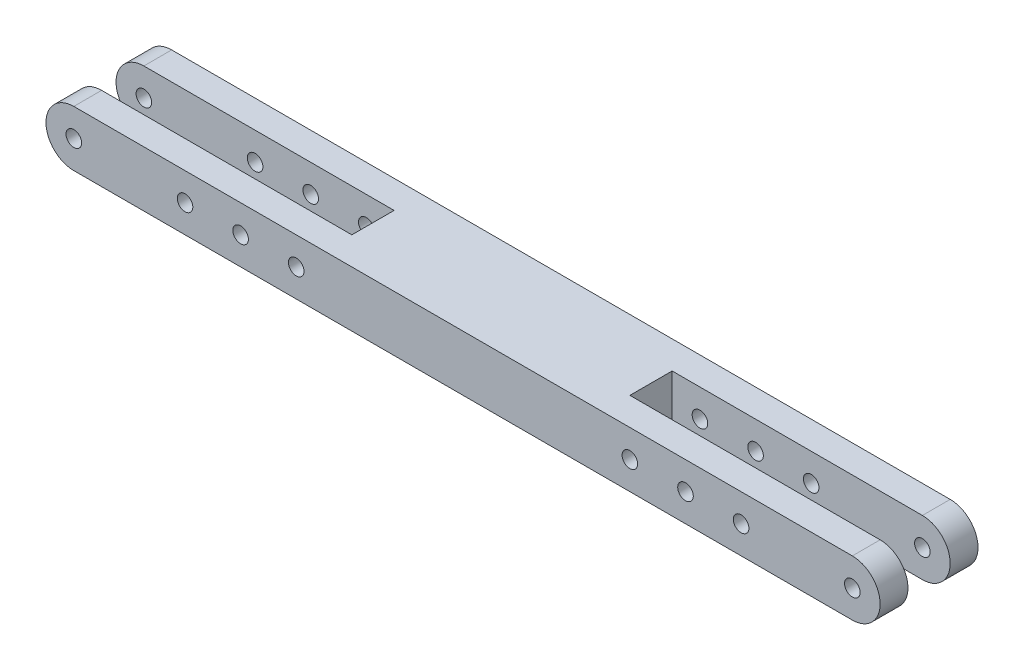
ISO-10303-21;
HEADER;
FILE_DESCRIPTION(('STEP AP214'),'2;1');
FILE_NAME('part.step','',(''),(''),'','','');
FILE_SCHEMA(('AUTOMOTIVE_DESIGN { 1 0 10303 214 1 1 1 1 }'));
ENDSEC;
DATA;
#1=APPLICATION_CONTEXT('core data for automotive mechanical design processes');
#2=APPLICATION_PROTOCOL_DEFINITION('international standard','automotive_design',2000,#1);
#3=PRODUCT_CONTEXT('',#1,'mechanical');
#4=PRODUCT('Part','Part','',(#3));
#5=PRODUCT_RELATED_PRODUCT_CATEGORY('part','',(#4));
#6=PRODUCT_DEFINITION_FORMATION('','',#4);
#7=PRODUCT_DEFINITION_CONTEXT('part definition',#1,'design');
#8=PRODUCT_DEFINITION('design','',#6,#7);
#9=PRODUCT_DEFINITION_SHAPE('','',#8);
#10=(LENGTH_UNIT() NAMED_UNIT(*) SI_UNIT(.MILLI.,.METRE.));
#11=(NAMED_UNIT(*) PLANE_ANGLE_UNIT() SI_UNIT($,.RADIAN.));
#12=(NAMED_UNIT(*) SI_UNIT($,.STERADIAN.) SOLID_ANGLE_UNIT());
#13=UNCERTAINTY_MEASURE_WITH_UNIT(LENGTH_MEASURE(1.E-05),#10,'distance_accuracy_value','');
#14=(GEOMETRIC_REPRESENTATION_CONTEXT(3) GLOBAL_UNCERTAINTY_ASSIGNED_CONTEXT((#13)) GLOBAL_UNIT_ASSIGNED_CONTEXT((#10,
#11,#12)) REPRESENTATION_CONTEXT('',''));
#15=CARTESIAN_POINT('',(0.,0.,0.));
#16=DIRECTION('',(0.,0.,1.));
#17=DIRECTION('',(1.,0.,0.));
#18=AXIS2_PLACEMENT_3D('',#15,#16,#17);
#19=CARTESIAN_POINT('',(177.8,0.,22.352));
#20=DIRECTION('',(0.,0.,-1.));
#21=DIRECTION('',(-1.,0.,0.));
#22=AXIS2_PLACEMENT_3D('',#19,#20,#21);
#23=CYLINDRICAL_SURFACE('',#22,6.35);
#24=CARTESIAN_POINT('',(177.8,0.,16.002));
#25=DIRECTION('',(0.,0.,1.));
#26=DIRECTION('',(1.,0.,0.));
#27=AXIS2_PLACEMENT_3D('',#24,#25,#26);
#28=CIRCLE('',#27,6.35);
#29=CARTESIAN_POINT('',(177.8,-6.35,16.002));
#30=VERTEX_POINT('',#29);
#31=CARTESIAN_POINT('',(177.8,6.35,16.002));
#32=VERTEX_POINT('',#31);
#33=EDGE_CURVE('E174',#30,#32,#28,.T.);
#34=ORIENTED_EDGE('',*,*,#33,.T.);
#35=DIRECTION('',(0.,0.,-1.));
#36=VECTOR('',#35,1.);
#37=CARTESIAN_POINT('',(177.8,6.35,22.352));
#38=LINE('',#37,#36);
#39=CARTESIAN_POINT('',(177.8,6.35,22.352));
#40=VERTEX_POINT('',#39);
#41=EDGE_CURVE('E295',#40,#32,#38,.T.);
#42=ORIENTED_EDGE('',*,*,#41,.F.);
#43=CARTESIAN_POINT('',(177.8,0.,22.352));
#44=DIRECTION('',(0.,0.,1.));
#45=DIRECTION('',(-1.,0.,0.));
#46=AXIS2_PLACEMENT_3D('',#43,#44,#45);
#47=CIRCLE('',#46,6.35);
#48=CARTESIAN_POINT('',(177.8,-6.35,22.352));
#49=VERTEX_POINT('',#48);
#50=EDGE_CURVE('E276',#49,#40,#47,.T.);
#51=ORIENTED_EDGE('',*,*,#50,.F.);
#52=DIRECTION('',(0.,0.,-1.));
#53=VECTOR('',#52,1.);
#54=CARTESIAN_POINT('',(177.8,-6.35,22.352));
#55=LINE('',#54,#53);
#56=EDGE_CURVE('E298',#49,#30,#55,.T.);
#57=ORIENTED_EDGE('',*,*,#56,.T.);
#58=EDGE_LOOP('',(#34,#42,#51,#57));
#59=FACE_BOUND('',#58,.T.);
#60=ADVANCED_FACE('F33',(#59),#23,.T.);
#61=CARTESIAN_POINT('',(127.,0.,22.352));
#62=DIRECTION('',(0.,0.,-1.));
#63=DIRECTION('',(-1.,0.,0.));
#64=AXIS2_PLACEMENT_3D('',#61,#62,#63);
#65=CYLINDRICAL_SURFACE('',#64,1.77800000000003);
#66=CARTESIAN_POINT('',(127.,0.,16.002));
#67=DIRECTION('',(0.,0.,1.));
#68=DIRECTION('',(1.,0.,0.));
#69=AXIS2_PLACEMENT_3D('',#66,#67,#68);
#70=CIRCLE('',#69,1.77800000000003);
#71=CARTESIAN_POINT('',(128.778,0.,16.002));
#72=VERTEX_POINT('',#71);
#73=EDGE_CURVE('E171',#72,#72,#70,.T.);
#74=ORIENTED_EDGE('',*,*,#73,.F.);
#75=EDGE_LOOP('',(#74));
#76=FACE_BOUND('',#75,.T.);
#77=CARTESIAN_POINT('',(127.,0.,22.352));
#78=DIRECTION('',(0.,0.,1.));
#79=DIRECTION('',(-1.,0.,0.));
#80=AXIS2_PLACEMENT_3D('',#77,#78,#79);
#81=CIRCLE('',#80,1.77800000000003);
#82=CARTESIAN_POINT('',(125.222,0.,22.352));
#83=VERTEX_POINT('',#82);
#84=EDGE_CURVE('E240',#83,#83,#81,.T.);
#85=ORIENTED_EDGE('',*,*,#84,.T.);
#86=EDGE_LOOP('',(#85));
#87=FACE_BOUND('',#86,.T.);
#88=ADVANCED_FACE('F336',(#76,#87),#65,.F.);
#89=CARTESIAN_POINT('',(139.7,0.,22.352));
#90=DIRECTION('',(0.,0.,-1.));
#91=DIRECTION('',(-1.,0.,0.));
#92=AXIS2_PLACEMENT_3D('',#89,#90,#91);
#93=CYLINDRICAL_SURFACE('',#92,1.77800000000001);
#94=CARTESIAN_POINT('',(139.7,0.,16.002));
#95=DIRECTION('',(0.,0.,1.));
#96=DIRECTION('',(1.,0.,0.));
#97=AXIS2_PLACEMENT_3D('',#94,#95,#96);
#98=CIRCLE('',#97,1.77800000000001);
#99=CARTESIAN_POINT('',(141.478,0.,16.002));
#100=VERTEX_POINT('',#99);
#101=EDGE_CURVE('E168',#100,#100,#98,.T.);
#102=ORIENTED_EDGE('',*,*,#101,.F.);
#103=EDGE_LOOP('',(#102));
#104=FACE_BOUND('',#103,.T.);
#105=CARTESIAN_POINT('',(139.7,0.,22.352));
#106=DIRECTION('',(0.,0.,1.));
#107=DIRECTION('',(-1.,0.,0.));
#108=AXIS2_PLACEMENT_3D('',#105,#106,#107);
#109=CIRCLE('',#108,1.77800000000001);
#110=CARTESIAN_POINT('',(137.922,0.,22.352));
#111=VERTEX_POINT('',#110);
#112=EDGE_CURVE('E234',#111,#111,#109,.T.);
#113=ORIENTED_EDGE('',*,*,#112,.T.);
#114=EDGE_LOOP('',(#113));
#115=FACE_BOUND('',#114,.T.);
#116=ADVANCED_FACE('F343',(#104,#115),#93,.F.);
#117=CARTESIAN_POINT('',(152.4,0.,22.352));
#118=DIRECTION('',(0.,0.,-1.));
#119=DIRECTION('',(-1.,0.,0.));
#120=AXIS2_PLACEMENT_3D('',#117,#118,#119);
#121=CYLINDRICAL_SURFACE('',#120,1.77800000000001);
#122=CARTESIAN_POINT('',(152.4,0.,16.002));
#123=DIRECTION('',(0.,0.,1.));
#124=DIRECTION('',(1.,0.,0.));
#125=AXIS2_PLACEMENT_3D('',#122,#123,#124);
#126=CIRCLE('',#125,1.77800000000001);
#127=CARTESIAN_POINT('',(154.178,0.,16.002));
#128=VERTEX_POINT('',#127);
#129=EDGE_CURVE('E165',#128,#128,#126,.T.);
#130=ORIENTED_EDGE('',*,*,#129,.F.);
#131=EDGE_LOOP('',(#130));
#132=FACE_BOUND('',#131,.T.);
#133=CARTESIAN_POINT('',(152.4,0.,22.352));
#134=DIRECTION('',(0.,0.,1.));
#135=DIRECTION('',(-1.,0.,0.));
#136=AXIS2_PLACEMENT_3D('',#133,#134,#135);
#137=CIRCLE('',#136,1.77800000000001);
#138=CARTESIAN_POINT('',(150.622,0.,22.352));
#139=VERTEX_POINT('',#138);
#140=EDGE_CURVE('E228',#139,#139,#137,.T.);
#141=ORIENTED_EDGE('',*,*,#140,.T.);
#142=EDGE_LOOP('',(#141));
#143=FACE_BOUND('',#142,.T.);
#144=ADVANCED_FACE('F406',(#132,#143),#121,.F.);
#145=CARTESIAN_POINT('',(177.8,0.,22.352));
#146=DIRECTION('',(0.,0.,-1.));
#147=DIRECTION('',(-1.,0.,0.));
#148=AXIS2_PLACEMENT_3D('',#145,#146,#147);
#149=CYLINDRICAL_SURFACE('',#148,1.77800000000001);
#150=CARTESIAN_POINT('',(177.8,0.,16.002));
#151=DIRECTION('',(0.,0.,1.));
#152=DIRECTION('',(1.,0.,0.));
#153=AXIS2_PLACEMENT_3D('',#150,#151,#152);
#154=CIRCLE('',#153,1.77800000000001);
#155=CARTESIAN_POINT('',(179.578,0.,16.002));
#156=VERTEX_POINT('',#155);
#157=EDGE_CURVE('E37',#156,#156,#154,.T.);
#158=ORIENTED_EDGE('',*,*,#157,.F.);
#159=EDGE_LOOP('',(#158));
#160=FACE_BOUND('',#159,.T.);
#161=CARTESIAN_POINT('',(177.8,0.,22.352));
#162=DIRECTION('',(0.,0.,1.));
#163=DIRECTION('',(-1.,0.,0.));
#164=AXIS2_PLACEMENT_3D('',#161,#162,#163);
#165=CIRCLE('',#164,1.77800000000001);
#166=CARTESIAN_POINT('',(176.022,0.,22.352));
#167=VERTEX_POINT('',#166);
#168=EDGE_CURVE('E222',#167,#167,#165,.T.);
#169=ORIENTED_EDGE('',*,*,#168,.T.);
#170=EDGE_LOOP('',(#169));
#171=FACE_BOUND('',#170,.T.);
#172=ADVANCED_FACE('F314',(#160,#171),#149,.F.);
#173=CARTESIAN_POINT('',(0.,0.,22.352));
#174=DIRECTION('',(0.,0.,-1.));
#175=DIRECTION('',(-1.,0.,0.));
#176=AXIS2_PLACEMENT_3D('',#173,#174,#175);
#177=CYLINDRICAL_SURFACE('',#176,6.35);
#178=CARTESIAN_POINT('',(0.,0.,6.35));
#179=DIRECTION('',(0.,0.,-1.));
#180=DIRECTION('',(-1.,0.,0.));
#181=AXIS2_PLACEMENT_3D('',#178,#179,#180);
#182=CIRCLE('',#181,6.35);
#183=CARTESIAN_POINT('',(0.,-6.35,6.35));
#184=VERTEX_POINT('',#183);
#185=CARTESIAN_POINT('',(0.,6.35,6.35));
#186=VERTEX_POINT('',#185);
#187=EDGE_CURVE('E219',#184,#186,#182,.T.);
#188=ORIENTED_EDGE('',*,*,#187,.T.);
#189=DIRECTION('',(0.,0.,-1.));
#190=VECTOR('',#189,1.);
#191=CARTESIAN_POINT('',(0.,6.35,22.352));
#192=LINE('',#191,#190);
#193=CARTESIAN_POINT('',(0.,6.35,0.));
#194=VERTEX_POINT('',#193);
#195=EDGE_CURVE('E280',#186,#194,#192,.T.);
#196=ORIENTED_EDGE('',*,*,#195,.T.);
#197=CARTESIAN_POINT('',(0.,0.,0.));
#198=DIRECTION('',(0.,0.,1.));
#199=DIRECTION('',(1.,0.,0.));
#200=AXIS2_PLACEMENT_3D('',#197,#198,#199);
#201=CIRCLE('',#200,6.35);
#202=CARTESIAN_POINT('',(0.,-6.35,0.));
#203=VERTEX_POINT('',#202);
#204=EDGE_CURVE('E267',#194,#203,#201,.T.);
#205=ORIENTED_EDGE('',*,*,#204,.T.);
#206=DIRECTION('',(0.,0.,-1.));
#207=VECTOR('',#206,1.);
#208=CARTESIAN_POINT('',(0.,-6.35,22.352));
#209=LINE('',#208,#207);
#210=EDGE_CURVE('E42',#184,#203,#209,.T.);
#211=ORIENTED_EDGE('',*,*,#210,.F.);
#212=EDGE_LOOP('',(#188,#196,#205,#211));
#213=FACE_BOUND('',#212,.T.);
#214=ADVANCED_FACE('F328',(#213),#177,.T.);
#215=CARTESIAN_POINT('',(0.,0.,22.352));
#216=DIRECTION('',(0.,0.,-1.));
#217=DIRECTION('',(-1.,0.,0.));
#218=AXIS2_PLACEMENT_3D('',#215,#216,#217);
#219=CYLINDRICAL_SURFACE('',#218,1.778);
#220=CARTESIAN_POINT('',(0.,0.,6.35));
#221=DIRECTION('',(0.,0.,-1.));
#222=DIRECTION('',(-1.,0.,0.));
#223=AXIS2_PLACEMENT_3D('',#220,#221,#222);
#224=CIRCLE('',#223,1.778);
#225=CARTESIAN_POINT('',(-1.778,0.,6.35));
#226=VERTEX_POINT('',#225);
#227=EDGE_CURVE('E216',#226,#226,#224,.T.);
#228=ORIENTED_EDGE('',*,*,#227,.F.);
#229=EDGE_LOOP('',(#228));
#230=FACE_BOUND('',#229,.T.);
#231=CARTESIAN_POINT('',(0.,0.,0.));
#232=DIRECTION('',(0.,0.,1.));
#233=DIRECTION('',(1.,0.,0.));
#234=AXIS2_PLACEMENT_3D('',#231,#232,#233);
#235=CIRCLE('',#234,1.778);
#236=CARTESIAN_POINT('',(1.778,0.,0.));
#237=VERTEX_POINT('',#236);
#238=EDGE_CURVE('E261',#237,#237,#235,.T.);
#239=ORIENTED_EDGE('',*,*,#238,.F.);
#240=EDGE_LOOP('',(#239));
#241=FACE_BOUND('',#240,.T.);
#242=ADVANCED_FACE('F428',(#230,#241),#219,.F.);
#243=CARTESIAN_POINT('',(25.4,0.,22.352));
#244=DIRECTION('',(0.,0.,-1.));
#245=DIRECTION('',(-1.,0.,0.));
#246=AXIS2_PLACEMENT_3D('',#243,#244,#245);
#247=CYLINDRICAL_SURFACE('',#246,1.778);
#248=CARTESIAN_POINT('',(25.4,0.,6.35));
#249=DIRECTION('',(0.,0.,-1.));
#250=DIRECTION('',(-1.,0.,0.));
#251=AXIS2_PLACEMENT_3D('',#248,#249,#250);
#252=CIRCLE('',#251,1.778);
#253=CARTESIAN_POINT('',(23.622,0.,6.35));
#254=VERTEX_POINT('',#253);
#255=EDGE_CURVE('E213',#254,#254,#252,.T.);
#256=ORIENTED_EDGE('',*,*,#255,.F.);
#257=EDGE_LOOP('',(#256));
#258=FACE_BOUND('',#257,.T.);
#259=CARTESIAN_POINT('',(25.4,0.,0.));
#260=DIRECTION('',(0.,0.,1.));
#261=DIRECTION('',(1.,0.,0.));
#262=AXIS2_PLACEMENT_3D('',#259,#260,#261);
#263=CIRCLE('',#262,1.778);
#264=CARTESIAN_POINT('',(27.178,0.,0.));
#265=VERTEX_POINT('',#264);
#266=EDGE_CURVE('E255',#265,#265,#263,.T.);
#267=ORIENTED_EDGE('',*,*,#266,.F.);
#268=EDGE_LOOP('',(#267));
#269=FACE_BOUND('',#268,.T.);
#270=ADVANCED_FACE('F425',(#258,#269),#247,.F.);
#271=CARTESIAN_POINT('',(38.1,0.,22.352));
#272=DIRECTION('',(0.,0.,-1.));
#273=DIRECTION('',(-1.,0.,0.));
#274=AXIS2_PLACEMENT_3D('',#271,#272,#273);
#275=CYLINDRICAL_SURFACE('',#274,1.778);
#276=CARTESIAN_POINT('',(38.1,0.,6.35));
#277=DIRECTION('',(0.,0.,-1.));
#278=DIRECTION('',(-1.,0.,0.));
#279=AXIS2_PLACEMENT_3D('',#276,#277,#278);
#280=CIRCLE('',#279,1.778);
#281=CARTESIAN_POINT('',(36.322,0.,6.35));
#282=VERTEX_POINT('',#281);
#283=EDGE_CURVE('E210',#282,#282,#280,.T.);
#284=ORIENTED_EDGE('',*,*,#283,.F.);
#285=EDGE_LOOP('',(#284));
#286=FACE_BOUND('',#285,.T.);
#287=CARTESIAN_POINT('',(38.1,0.,0.));
#288=DIRECTION('',(0.,0.,1.));
#289=DIRECTION('',(1.,0.,0.));
#290=AXIS2_PLACEMENT_3D('',#287,#288,#289);
#291=CIRCLE('',#290,1.778);
#292=CARTESIAN_POINT('',(39.878,0.,0.));
#293=VERTEX_POINT('',#292);
#294=EDGE_CURVE('E249',#293,#293,#291,.T.);
#295=ORIENTED_EDGE('',*,*,#294,.F.);
#296=EDGE_LOOP('',(#295));
#297=FACE_BOUND('',#296,.T.);
#298=ADVANCED_FACE('F421',(#286,#297),#275,.F.);
#299=CARTESIAN_POINT('',(50.8,0.,22.352));
#300=DIRECTION('',(0.,0.,-1.));
#301=DIRECTION('',(-1.,0.,0.));
#302=AXIS2_PLACEMENT_3D('',#299,#300,#301);
#303=CYLINDRICAL_SURFACE('',#302,1.77800000000001);
#304=CARTESIAN_POINT('',(50.8,0.,6.35));
#305=DIRECTION('',(0.,0.,-1.));
#306=DIRECTION('',(-1.,0.,0.));
#307=AXIS2_PLACEMENT_3D('',#304,#305,#306);
#308=CIRCLE('',#307,1.77800000000001);
#309=CARTESIAN_POINT('',(49.022,0.,6.35));
#310=VERTEX_POINT('',#309);
#311=EDGE_CURVE('E209',#310,#310,#308,.T.);
#312=ORIENTED_EDGE('',*,*,#311,.F.);
#313=EDGE_LOOP('',(#312));
#314=FACE_BOUND('',#313,.T.);
#315=CARTESIAN_POINT('',(50.8,0.,0.));
#316=DIRECTION('',(0.,0.,1.));
#317=DIRECTION('',(1.,0.,0.));
#318=AXIS2_PLACEMENT_3D('',#315,#316,#317);
#319=CIRCLE('',#318,1.77800000000001);
#320=CARTESIAN_POINT('',(52.578,0.,0.));
#321=VERTEX_POINT('',#320);
#322=EDGE_CURVE('E243',#321,#321,#319,.T.);
#323=ORIENTED_EDGE('',*,*,#322,.F.);
#324=EDGE_LOOP('',(#323));
#325=FACE_BOUND('',#324,.T.);
#326=ADVANCED_FACE('F329',(#314,#325),#303,.F.);
#327=CARTESIAN_POINT('',(0.,0.,22.352));
#328=DIRECTION('',(0.,0.,1.));
#329=DIRECTION('',(1.,0.,0.));
#330=AXIS2_PLACEMENT_3D('',#327,#328,#329);
#331=PLANE('',#330);
#332=ORIENTED_EDGE('',*,*,#140,.F.);
#333=EDGE_LOOP('',(#332));
#334=FACE_BOUND('',#333,.T.);
#335=ORIENTED_EDGE('',*,*,#84,.F.);
#336=EDGE_LOOP('',(#335));
#337=FACE_BOUND('',#336,.T.);
#338=CARTESIAN_POINT('',(38.1,0.,22.352));
#339=DIRECTION('',(0.,0.,1.));
#340=DIRECTION('',(1.,0.,0.));
#341=AXIS2_PLACEMENT_3D('',#338,#339,#340);
#342=CIRCLE('',#341,1.778);
#343=CARTESIAN_POINT('',(39.878,0.,22.352));
#344=VERTEX_POINT('',#343);
#345=EDGE_CURVE('E252',#344,#344,#342,.T.);
#346=ORIENTED_EDGE('',*,*,#345,.F.);
#347=EDGE_LOOP('',(#346));
#348=FACE_BOUND('',#347,.T.);
#349=CARTESIAN_POINT('',(0.,0.,22.352));
#350=DIRECTION('',(0.,0.,1.));
#351=DIRECTION('',(1.,0.,0.));
#352=AXIS2_PLACEMENT_3D('',#349,#350,#351);
#353=CIRCLE('',#352,1.778);
#354=CARTESIAN_POINT('',(1.778,0.,22.352));
#355=VERTEX_POINT('',#354);
#356=EDGE_CURVE('E264',#355,#355,#353,.T.);
#357=ORIENTED_EDGE('',*,*,#356,.F.);
#358=EDGE_LOOP('',(#357));
#359=FACE_BOUND('',#358,.T.);
#360=CARTESIAN_POINT('',(0.,0.,22.352));
#361=DIRECTION('',(0.,0.,1.));
#362=DIRECTION('',(1.,0.,0.));
#363=AXIS2_PLACEMENT_3D('',#360,#361,#362);
#364=CIRCLE('',#363,6.35);
#365=CARTESIAN_POINT('',(0.,6.35,22.352));
#366=VERTEX_POINT('',#365);
#367=CARTESIAN_POINT('',(0.,-6.35,22.352));
#368=VERTEX_POINT('',#367);
#369=EDGE_CURVE('E270',#366,#368,#364,.T.);
#370=ORIENTED_EDGE('',*,*,#369,.T.);
#371=DIRECTION('',(1.,0.,0.));
#372=VECTOR('',#371,1.);
#373=CARTESIAN_POINT('',(0.,-6.35,22.352));
#374=LINE('',#373,#372);
#375=EDGE_CURVE('E273',#368,#49,#374,.T.);
#376=ORIENTED_EDGE('',*,*,#375,.T.);
#377=ORIENTED_EDGE('',*,*,#50,.T.);
#378=DIRECTION('',(-1.,0.,0.));
#379=VECTOR('',#378,1.);
#380=CARTESIAN_POINT('',(0.,6.35,22.352));
#381=LINE('',#380,#379);
#382=EDGE_CURVE('E278',#40,#366,#381,.T.);
#383=ORIENTED_EDGE('',*,*,#382,.T.);
#384=EDGE_LOOP('',(#370,#376,#377,#383));
#385=FACE_BOUND('',#384,.T.);
#386=CARTESIAN_POINT('',(25.4,0.,22.352));
#387=DIRECTION('',(0.,0.,1.));
#388=DIRECTION('',(1.,0.,0.));
#389=AXIS2_PLACEMENT_3D('',#386,#387,#388);
#390=CIRCLE('',#389,1.778);
#391=CARTESIAN_POINT('',(27.178,0.,22.352));
#392=VERTEX_POINT('',#391);
#393=EDGE_CURVE('E258',#392,#392,#390,.T.);
#394=ORIENTED_EDGE('',*,*,#393,.F.);
#395=EDGE_LOOP('',(#394));
#396=FACE_BOUND('',#395,.T.);
#397=CARTESIAN_POINT('',(50.8,0.,22.352));
#398=DIRECTION('',(0.,0.,1.));
#399=DIRECTION('',(1.,0.,0.));
#400=AXIS2_PLACEMENT_3D('',#397,#398,#399);
#401=CIRCLE('',#400,1.77800000000001);
#402=CARTESIAN_POINT('',(52.578,0.,22.352));
#403=VERTEX_POINT('',#402);
#404=EDGE_CURVE('E246',#403,#403,#401,.T.);
#405=ORIENTED_EDGE('',*,*,#404,.F.);
#406=EDGE_LOOP('',(#405));
#407=FACE_BOUND('',#406,.T.);
#408=ORIENTED_EDGE('',*,*,#112,.F.);
#409=EDGE_LOOP('',(#408));
#410=FACE_BOUND('',#409,.T.);
#411=ORIENTED_EDGE('',*,*,#168,.F.);
#412=EDGE_LOOP('',(#411));
#413=FACE_BOUND('',#412,.T.);
#414=ADVANCED_FACE('F319',(#334,#337,#348,#359,#385,#396,#407,#410,#413),#331,.T.);
#415=CARTESIAN_POINT('',(0.,0.,0.));
#416=DIRECTION('',(0.,0.,1.));
#417=DIRECTION('',(1.,0.,0.));
#418=AXIS2_PLACEMENT_3D('',#415,#416,#417);
#419=PLANE('',#418);
#420=ORIENTED_EDGE('',*,*,#204,.F.);
#421=DIRECTION('',(-1.,0.,0.));
#422=VECTOR('',#421,1.);
#423=CARTESIAN_POINT('',(0.,6.35,0.));
#424=LINE('',#423,#422);
#425=CARTESIAN_POINT('',(177.8,6.35,0.));
#426=VERTEX_POINT('',#425);
#427=EDGE_CURVE('E274',#426,#194,#424,.T.);
#428=ORIENTED_EDGE('',*,*,#427,.F.);
#429=CARTESIAN_POINT('',(177.8,0.,0.));
#430=DIRECTION('',(0.,0.,1.));
#431=DIRECTION('',(-1.,0.,0.));
#432=AXIS2_PLACEMENT_3D('',#429,#430,#431);
#433=CIRCLE('',#432,6.35);
#434=CARTESIAN_POINT('',(177.8,-6.35,0.));
#435=VERTEX_POINT('',#434);
#436=EDGE_CURVE('E286',#435,#426,#433,.T.);
#437=ORIENTED_EDGE('',*,*,#436,.F.);
#438=DIRECTION('',(1.,0.,0.));
#439=VECTOR('',#438,1.);
#440=CARTESIAN_POINT('',(0.,-6.35,0.));
#441=LINE('',#440,#439);
#442=EDGE_CURVE('E283',#203,#435,#441,.T.);
#443=ORIENTED_EDGE('',*,*,#442,.F.);
#444=EDGE_LOOP('',(#420,#428,#437,#443));
#445=FACE_BOUND('',#444,.T.);
#446=ORIENTED_EDGE('',*,*,#238,.T.);
#447=EDGE_LOOP('',(#446));
#448=FACE_BOUND('',#447,.T.);
#449=ORIENTED_EDGE('',*,*,#266,.T.);
#450=EDGE_LOOP('',(#449));
#451=FACE_BOUND('',#450,.T.);
#452=ORIENTED_EDGE('',*,*,#294,.T.);
#453=EDGE_LOOP('',(#452));
#454=FACE_BOUND('',#453,.T.);
#455=ORIENTED_EDGE('',*,*,#322,.T.);
#456=EDGE_LOOP('',(#455));
#457=FACE_BOUND('',#456,.T.);
#458=CARTESIAN_POINT('',(127.,0.,0.));
#459=DIRECTION('',(0.,0.,1.));
#460=DIRECTION('',(-1.,0.,0.));
#461=AXIS2_PLACEMENT_3D('',#458,#459,#460);
#462=CIRCLE('',#461,1.77800000000003);
#463=CARTESIAN_POINT('',(125.222,0.,0.));
#464=VERTEX_POINT('',#463);
#465=EDGE_CURVE('E237',#464,#464,#462,.T.);
#466=ORIENTED_EDGE('',*,*,#465,.T.);
#467=EDGE_LOOP('',(#466));
#468=FACE_BOUND('',#467,.T.);
#469=CARTESIAN_POINT('',(139.7,0.,0.));
#470=DIRECTION('',(0.,0.,1.));
#471=DIRECTION('',(-1.,0.,0.));
#472=AXIS2_PLACEMENT_3D('',#469,#470,#471);
#473=CIRCLE('',#472,1.77800000000001);
#474=CARTESIAN_POINT('',(137.922,0.,0.));
#475=VERTEX_POINT('',#474);
#476=EDGE_CURVE('E231',#475,#475,#473,.T.);
#477=ORIENTED_EDGE('',*,*,#476,.T.);
#478=EDGE_LOOP('',(#477));
#479=FACE_BOUND('',#478,.T.);
#480=CARTESIAN_POINT('',(152.4,0.,0.));
#481=DIRECTION('',(0.,0.,1.));
#482=DIRECTION('',(-1.,0.,0.));
#483=AXIS2_PLACEMENT_3D('',#480,#481,#482);
#484=CIRCLE('',#483,1.77800000000001);
#485=CARTESIAN_POINT('',(150.622,0.,0.));
#486=VERTEX_POINT('',#485);
#487=EDGE_CURVE('E225',#486,#486,#484,.T.);
#488=ORIENTED_EDGE('',*,*,#487,.T.);
#489=EDGE_LOOP('',(#488));
#490=FACE_BOUND('',#489,.T.);
#491=CARTESIAN_POINT('',(177.8,0.,0.));
#492=DIRECTION('',(0.,0.,1.));
#493=DIRECTION('',(-1.,0.,0.));
#494=AXIS2_PLACEMENT_3D('',#491,#492,#493);
#495=CIRCLE('',#494,1.77800000000001);
#496=CARTESIAN_POINT('',(176.022,0.,0.));
#497=VERTEX_POINT('',#496);
#498=EDGE_CURVE('E221',#497,#497,#495,.T.);
#499=ORIENTED_EDGE('',*,*,#498,.T.);
#500=EDGE_LOOP('',(#499));
#501=FACE_BOUND('',#500,.T.);
#502=ADVANCED_FACE('F317',(#445,#448,#451,#454,#457,#468,#479,#490,#501),#419,.F.);
#503=CARTESIAN_POINT('',(0.,6.35,16.002));
#504=VERTEX_POINT('',#503);
#505=EDGE_CURVE('E291',#366,#504,#192,.T.);
#506=ORIENTED_EDGE('',*,*,#505,.T.);
#507=CARTESIAN_POINT('',(0.,0.,16.002));
#508=DIRECTION('',(0.,0.,1.));
#509=DIRECTION('',(1.,0.,0.));
#510=AXIS2_PLACEMENT_3D('',#507,#508,#509);
#511=CIRCLE('',#510,6.35);
#512=CARTESIAN_POINT('',(0.,-6.35,16.002));
#513=VERTEX_POINT('',#512);
#514=EDGE_CURVE('E58',#504,#513,#511,.T.);
#515=ORIENTED_EDGE('',*,*,#514,.T.);
#516=EDGE_CURVE('E11',#368,#513,#209,.T.);
#517=ORIENTED_EDGE('',*,*,#516,.F.);
#518=ORIENTED_EDGE('',*,*,#369,.F.);
#519=EDGE_LOOP('',(#506,#515,#517,#518));
#520=FACE_BOUND('',#519,.T.);
#521=ADVANCED_FACE('F35',(#520),#177,.T.);
#522=CARTESIAN_POINT('',(0.,-6.35,22.352));
#523=DIRECTION('',(0.,1.,0.));
#524=DIRECTION('',(0.,0.,1.));
#525=AXIS2_PLACEMENT_3D('',#522,#523,#524);
#526=PLANE('',#525);
#527=DIRECTION('',(0.,0.,1.));
#528=VECTOR('',#527,1.);
#529=CARTESIAN_POINT('',(120.65,-6.35,6.35000000000001));
#530=LINE('',#529,#528);
#531=CARTESIAN_POINT('',(120.65,-6.35,6.35000000000001));
#532=VERTEX_POINT('',#531);
#533=CARTESIAN_POINT('',(120.65,-6.35,16.002));
#534=VERTEX_POINT('',#533);
#535=EDGE_CURVE('E136',#532,#534,#530,.T.);
#536=ORIENTED_EDGE('',*,*,#535,.T.);
#537=DIRECTION('',(1.,0.,0.));
#538=VECTOR('',#537,1.);
#539=CARTESIAN_POINT('',(184.15,-6.35,16.002));
#540=LINE('',#539,#538);
#541=EDGE_CURVE('E139',#534,#30,#540,.T.);
#542=ORIENTED_EDGE('',*,*,#541,.T.);
#543=ORIENTED_EDGE('',*,*,#56,.F.);
#544=ORIENTED_EDGE('',*,*,#375,.F.);
#545=ORIENTED_EDGE('',*,*,#516,.T.);
#546=DIRECTION('',(1.,0.,0.));
#547=VECTOR('',#546,1.);
#548=CARTESIAN_POINT('',(-6.35,-6.35,16.002));
#549=LINE('',#548,#547);
#550=CARTESIAN_POINT('',(57.15,-6.35,16.002));
#551=VERTEX_POINT('',#550);
#552=EDGE_CURVE('E184',#513,#551,#549,.T.);
#553=ORIENTED_EDGE('',*,*,#552,.T.);
#554=DIRECTION('',(0.,0.,-1.));
#555=VECTOR('',#554,1.);
#556=CARTESIAN_POINT('',(57.15,-6.35,6.35));
#557=LINE('',#556,#555);
#558=CARTESIAN_POINT('',(57.15,-6.35,6.35));
#559=VERTEX_POINT('',#558);
#560=EDGE_CURVE('E187',#551,#559,#557,.T.);
#561=ORIENTED_EDGE('',*,*,#560,.T.);
#562=DIRECTION('',(-1.,0.,0.));
#563=VECTOR('',#562,1.);
#564=CARTESIAN_POINT('',(-6.35,-6.35,6.35));
#565=LINE('',#564,#563);
#566=EDGE_CURVE('E190',#559,#184,#565,.T.);
#567=ORIENTED_EDGE('',*,*,#566,.T.);
#568=ORIENTED_EDGE('',*,*,#210,.T.);
#569=ORIENTED_EDGE('',*,*,#442,.T.);
#570=CARTESIAN_POINT('',(177.8,-6.35,6.35));
#571=VERTEX_POINT('',#570);
#572=EDGE_CURVE('E297',#571,#435,#55,.T.);
#573=ORIENTED_EDGE('',*,*,#572,.F.);
#574=DIRECTION('',(-1.,0.,0.));
#575=VECTOR('',#574,1.);
#576=CARTESIAN_POINT('',(184.15,-6.35,6.35));
#577=LINE('',#576,#575);
#578=EDGE_CURVE('E146',#571,#532,#577,.T.);
#579=ORIENTED_EDGE('',*,*,#578,.T.);
#580=EDGE_LOOP('',(#536,#542,#543,#544,#545,#553,#561,#567,#568,#569,#573,#579));
#581=FACE_BOUND('',#580,.T.);
#582=ADVANCED_FACE('F326',(#581),#526,.F.);
#583=CARTESIAN_POINT('',(177.8,6.35,6.35));
#584=VERTEX_POINT('',#583);
#585=EDGE_CURVE('E294',#584,#426,#38,.T.);
#586=ORIENTED_EDGE('',*,*,#585,.F.);
#587=CARTESIAN_POINT('',(177.8,0.,6.35));
#588=DIRECTION('',(0.,0.,-1.));
#589=DIRECTION('',(-1.,0.,0.));
#590=AXIS2_PLACEMENT_3D('',#587,#588,#589);
#591=CIRCLE('',#590,6.35);
#592=EDGE_CURVE('E50',#584,#571,#591,.T.);
#593=ORIENTED_EDGE('',*,*,#592,.T.);
#594=ORIENTED_EDGE('',*,*,#572,.T.);
#595=ORIENTED_EDGE('',*,*,#436,.T.);
#596=EDGE_LOOP('',(#586,#593,#594,#595));
#597=FACE_BOUND('',#596,.T.);
#598=ADVANCED_FACE('F339',(#597),#23,.T.);
#599=CARTESIAN_POINT('',(0.,6.35,22.352));
#600=DIRECTION('',(0.,-1.,0.));
#601=DIRECTION('',(0.,0.,-1.));
#602=AXIS2_PLACEMENT_3D('',#599,#600,#601);
#603=PLANE('',#602);
#604=ORIENTED_EDGE('',*,*,#41,.T.);
#605=DIRECTION('',(1.,0.,0.));
#606=VECTOR('',#605,1.);
#607=CARTESIAN_POINT('',(184.15,6.35,16.002));
#608=LINE('',#607,#606);
#609=CARTESIAN_POINT('',(120.65,6.35,16.002));
#610=VERTEX_POINT('',#609);
#611=EDGE_CURVE('E144',#610,#32,#608,.T.);
#612=ORIENTED_EDGE('',*,*,#611,.F.);
#613=DIRECTION('',(0.,0.,1.));
#614=VECTOR('',#613,1.);
#615=CARTESIAN_POINT('',(120.65,6.35,6.35000000000001));
#616=LINE('',#615,#614);
#617=CARTESIAN_POINT('',(120.65,6.35,6.35000000000001));
#618=VERTEX_POINT('',#617);
#619=EDGE_CURVE('E129',#618,#610,#616,.T.);
#620=ORIENTED_EDGE('',*,*,#619,.F.);
#621=DIRECTION('',(-1.,0.,0.));
#622=VECTOR('',#621,1.);
#623=CARTESIAN_POINT('',(184.15,6.35,6.35));
#624=LINE('',#623,#622);
#625=EDGE_CURVE('E121',#584,#618,#624,.T.);
#626=ORIENTED_EDGE('',*,*,#625,.F.);
#627=ORIENTED_EDGE('',*,*,#585,.T.);
#628=ORIENTED_EDGE('',*,*,#427,.T.);
#629=ORIENTED_EDGE('',*,*,#195,.F.);
#630=DIRECTION('',(-1.,0.,0.));
#631=VECTOR('',#630,1.);
#632=CARTESIAN_POINT('',(-6.35,6.35,6.35));
#633=LINE('',#632,#631);
#634=CARTESIAN_POINT('',(57.15,6.35,6.35));
#635=VERTEX_POINT('',#634);
#636=EDGE_CURVE('E181',#635,#186,#633,.T.);
#637=ORIENTED_EDGE('',*,*,#636,.F.);
#638=DIRECTION('',(0.,0.,-1.));
#639=VECTOR('',#638,1.);
#640=CARTESIAN_POINT('',(57.15,6.35,6.35));
#641=LINE('',#640,#639);
#642=CARTESIAN_POINT('',(57.15,6.35,16.002));
#643=VERTEX_POINT('',#642);
#644=EDGE_CURVE('E178',#643,#635,#641,.T.);
#645=ORIENTED_EDGE('',*,*,#644,.F.);
#646=DIRECTION('',(1.,0.,0.));
#647=VECTOR('',#646,1.);
#648=CARTESIAN_POINT('',(-6.35,6.35,16.002));
#649=LINE('',#648,#647);
#650=EDGE_CURVE('E176',#504,#643,#649,.T.);
#651=ORIENTED_EDGE('',*,*,#650,.F.);
#652=ORIENTED_EDGE('',*,*,#505,.F.);
#653=ORIENTED_EDGE('',*,*,#382,.F.);
#654=EDGE_LOOP('',(#604,#612,#620,#626,#627,#628,#629,#637,#645,#651,#652,#653));
#655=FACE_BOUND('',#654,.T.);
#656=ADVANCED_FACE('F142',(#655),#603,.F.);
#657=CARTESIAN_POINT('',(0.,0.,16.002));
#658=DIRECTION('',(0.,0.,1.));
#659=DIRECTION('',(1.,0.,0.));
#660=AXIS2_PLACEMENT_3D('',#657,#658,#659);
#661=CIRCLE('',#660,1.778);
#662=CARTESIAN_POINT('',(1.778,0.,16.002));
#663=VERTEX_POINT('',#662);
#664=EDGE_CURVE('E205',#663,#663,#661,.T.);
#665=ORIENTED_EDGE('',*,*,#664,.F.);
#666=EDGE_LOOP('',(#665));
#667=FACE_BOUND('',#666,.T.);
#668=ORIENTED_EDGE('',*,*,#356,.T.);
#669=EDGE_LOOP('',(#668));
#670=FACE_BOUND('',#669,.T.);
#671=ADVANCED_FACE('F353',(#667,#670),#219,.F.);
#672=CARTESIAN_POINT('',(25.4,0.,16.002));
#673=DIRECTION('',(0.,0.,1.));
#674=DIRECTION('',(1.,0.,0.));
#675=AXIS2_PLACEMENT_3D('',#672,#673,#674);
#676=CIRCLE('',#675,1.778);
#677=CARTESIAN_POINT('',(27.178,0.,16.002));
#678=VERTEX_POINT('',#677);
#679=EDGE_CURVE('E202',#678,#678,#676,.T.);
#680=ORIENTED_EDGE('',*,*,#679,.F.);
#681=EDGE_LOOP('',(#680));
#682=FACE_BOUND('',#681,.T.);
#683=ORIENTED_EDGE('',*,*,#393,.T.);
#684=EDGE_LOOP('',(#683));
#685=FACE_BOUND('',#684,.T.);
#686=ADVANCED_FACE('F419',(#682,#685),#247,.F.);
#687=CARTESIAN_POINT('',(38.1,0.,16.002));
#688=DIRECTION('',(0.,0.,1.));
#689=DIRECTION('',(1.,0.,0.));
#690=AXIS2_PLACEMENT_3D('',#687,#688,#689);
#691=CIRCLE('',#690,1.778);
#692=CARTESIAN_POINT('',(39.878,0.,16.002));
#693=VERTEX_POINT('',#692);
#694=EDGE_CURVE('E199',#693,#693,#691,.T.);
#695=ORIENTED_EDGE('',*,*,#694,.F.);
#696=EDGE_LOOP('',(#695));
#697=FACE_BOUND('',#696,.T.);
#698=ORIENTED_EDGE('',*,*,#345,.T.);
#699=EDGE_LOOP('',(#698));
#700=FACE_BOUND('',#699,.T.);
#701=ADVANCED_FACE('F415',(#697,#700),#275,.F.);
#702=CARTESIAN_POINT('',(50.8,0.,16.002));
#703=DIRECTION('',(0.,0.,1.));
#704=DIRECTION('',(1.,0.,0.));
#705=AXIS2_PLACEMENT_3D('',#702,#703,#704);
#706=CIRCLE('',#705,1.77800000000001);
#707=CARTESIAN_POINT('',(52.578,0.,16.002));
#708=VERTEX_POINT('',#707);
#709=EDGE_CURVE('E196',#708,#708,#706,.T.);
#710=ORIENTED_EDGE('',*,*,#709,.F.);
#711=EDGE_LOOP('',(#710));
#712=FACE_BOUND('',#711,.T.);
#713=ORIENTED_EDGE('',*,*,#404,.T.);
#714=EDGE_LOOP('',(#713));
#715=FACE_BOUND('',#714,.T.);
#716=ADVANCED_FACE('F411',(#712,#715),#303,.F.);
#717=CARTESIAN_POINT('',(127.,0.,6.35));
#718=DIRECTION('',(0.,0.,-1.));
#719=DIRECTION('',(-1.,0.,0.));
#720=AXIS2_PLACEMENT_3D('',#717,#718,#719);
#721=CIRCLE('',#720,1.77800000000003);
#722=CARTESIAN_POINT('',(125.222,0.,6.35));
#723=VERTEX_POINT('',#722);
#724=EDGE_CURVE('E161',#723,#723,#721,.T.);
#725=ORIENTED_EDGE('',*,*,#724,.F.);
#726=EDGE_LOOP('',(#725));
#727=FACE_BOUND('',#726,.T.);
#728=ORIENTED_EDGE('',*,*,#465,.F.);
#729=EDGE_LOOP('',(#728));
#730=FACE_BOUND('',#729,.T.);
#731=ADVANCED_FACE('F346',(#727,#730),#65,.F.);
#732=CARTESIAN_POINT('',(139.7,0.,6.35));
#733=DIRECTION('',(0.,0.,-1.));
#734=DIRECTION('',(-1.,0.,0.));
#735=AXIS2_PLACEMENT_3D('',#732,#733,#734);
#736=CIRCLE('',#735,1.77800000000001);
#737=CARTESIAN_POINT('',(137.922,0.,6.35));
#738=VERTEX_POINT('',#737);
#739=EDGE_CURVE('E158',#738,#738,#736,.T.);
#740=ORIENTED_EDGE('',*,*,#739,.F.);
#741=EDGE_LOOP('',(#740));
#742=FACE_BOUND('',#741,.T.);
#743=ORIENTED_EDGE('',*,*,#476,.F.);
#744=EDGE_LOOP('',(#743));
#745=FACE_BOUND('',#744,.T.);
#746=ADVANCED_FACE('F404',(#742,#745),#93,.F.);
#747=CARTESIAN_POINT('',(152.4,0.,6.35));
#748=DIRECTION('',(0.,0.,-1.));
#749=DIRECTION('',(-1.,0.,0.));
#750=AXIS2_PLACEMENT_3D('',#747,#748,#749);
#751=CIRCLE('',#750,1.77800000000001);
#752=CARTESIAN_POINT('',(150.622,0.,6.35));
#753=VERTEX_POINT('',#752);
#754=EDGE_CURVE('E155',#753,#753,#751,.T.);
#755=ORIENTED_EDGE('',*,*,#754,.F.);
#756=EDGE_LOOP('',(#755));
#757=FACE_BOUND('',#756,.T.);
#758=ORIENTED_EDGE('',*,*,#487,.F.);
#759=EDGE_LOOP('',(#758));
#760=FACE_BOUND('',#759,.T.);
#761=ADVANCED_FACE('F312',(#757,#760),#121,.F.);
#762=CARTESIAN_POINT('',(177.8,0.,6.35));
#763=DIRECTION('',(0.,0.,-1.));
#764=DIRECTION('',(-1.,0.,0.));
#765=AXIS2_PLACEMENT_3D('',#762,#763,#764);
#766=CIRCLE('',#765,1.77800000000001);
#767=CARTESIAN_POINT('',(176.022,0.,6.35));
#768=VERTEX_POINT('',#767);
#769=EDGE_CURVE('E153',#768,#768,#766,.T.);
#770=ORIENTED_EDGE('',*,*,#769,.F.);
#771=EDGE_LOOP('',(#770));
#772=FACE_BOUND('',#771,.T.);
#773=ORIENTED_EDGE('',*,*,#498,.F.);
#774=EDGE_LOOP('',(#773));
#775=FACE_BOUND('',#774,.T.);
#776=ADVANCED_FACE('F308',(#772,#775),#149,.F.);
#777=CARTESIAN_POINT('',(-6.35,-6.35,6.35));
#778=DIRECTION('',(0.,0.,-1.));
#779=DIRECTION('',(-1.,0.,0.));
#780=AXIS2_PLACEMENT_3D('',#777,#778,#779);
#781=PLANE('',#780);
#782=ORIENTED_EDGE('',*,*,#227,.T.);
#783=EDGE_LOOP('',(#782));
#784=FACE_BOUND('',#783,.T.);
#785=ORIENTED_EDGE('',*,*,#255,.T.);
#786=EDGE_LOOP('',(#785));
#787=FACE_BOUND('',#786,.T.);
#788=ORIENTED_EDGE('',*,*,#283,.T.);
#789=EDGE_LOOP('',(#788));
#790=FACE_BOUND('',#789,.T.);
#791=ORIENTED_EDGE('',*,*,#311,.T.);
#792=EDGE_LOOP('',(#791));
#793=FACE_BOUND('',#792,.T.);
#794=ORIENTED_EDGE('',*,*,#187,.F.);
#795=ORIENTED_EDGE('',*,*,#566,.F.);
#796=DIRECTION('',(0.,1.,0.));
#797=VECTOR('',#796,1.);
#798=CARTESIAN_POINT('',(57.15,-6.35,6.35));
#799=LINE('',#798,#797);
#800=EDGE_CURVE('E194',#559,#635,#799,.T.);
#801=ORIENTED_EDGE('',*,*,#800,.T.);
#802=ORIENTED_EDGE('',*,*,#636,.T.);
#803=EDGE_LOOP('',(#794,#795,#801,#802));
#804=FACE_BOUND('',#803,.T.);
#805=ADVANCED_FACE('F311',(#784,#787,#790,#793,#804),#781,.F.);
#806=CARTESIAN_POINT('',(-6.35,-6.35,16.002));
#807=DIRECTION('',(0.,0.,1.));
#808=DIRECTION('',(1.,0.,0.));
#809=AXIS2_PLACEMENT_3D('',#806,#807,#808);
#810=PLANE('',#809);
#811=ORIENTED_EDGE('',*,*,#664,.T.);
#812=EDGE_LOOP('',(#811));
#813=FACE_BOUND('',#812,.T.);
#814=ORIENTED_EDGE('',*,*,#679,.T.);
#815=EDGE_LOOP('',(#814));
#816=FACE_BOUND('',#815,.T.);
#817=ORIENTED_EDGE('',*,*,#694,.T.);
#818=EDGE_LOOP('',(#817));
#819=FACE_BOUND('',#818,.T.);
#820=ORIENTED_EDGE('',*,*,#709,.T.);
#821=EDGE_LOOP('',(#820));
#822=FACE_BOUND('',#821,.T.);
#823=ORIENTED_EDGE('',*,*,#650,.T.);
#824=DIRECTION('',(0.,1.,0.));
#825=VECTOR('',#824,1.);
#826=CARTESIAN_POINT('',(57.15,-6.35,16.002));
#827=LINE('',#826,#825);
#828=EDGE_CURVE('E193',#551,#643,#827,.T.);
#829=ORIENTED_EDGE('',*,*,#828,.F.);
#830=ORIENTED_EDGE('',*,*,#552,.F.);
#831=ORIENTED_EDGE('',*,*,#514,.F.);
#832=EDGE_LOOP('',(#823,#829,#830,#831));
#833=FACE_BOUND('',#832,.T.);
#834=ADVANCED_FACE('F369',(#813,#816,#819,#822,#833),#810,.F.);
#835=CARTESIAN_POINT('',(57.15,-6.35,6.35));
#836=DIRECTION('',(1.,0.,0.));
#837=DIRECTION('',(0.,0.,-1.));
#838=AXIS2_PLACEMENT_3D('',#835,#836,#837);
#839=PLANE('',#838);
#840=ORIENTED_EDGE('',*,*,#800,.F.);
#841=ORIENTED_EDGE('',*,*,#560,.F.);
#842=ORIENTED_EDGE('',*,*,#828,.T.);
#843=ORIENTED_EDGE('',*,*,#644,.T.);
#844=EDGE_LOOP('',(#840,#841,#842,#843));
#845=FACE_BOUND('',#844,.T.);
#846=ADVANCED_FACE('F367',(#845),#839,.F.);
#847=CARTESIAN_POINT('',(184.15,-6.35,16.002));
#848=DIRECTION('',(0.,0.,1.));
#849=DIRECTION('',(1.,0.,0.));
#850=AXIS2_PLACEMENT_3D('',#847,#848,#849);
#851=PLANE('',#850);
#852=ORIENTED_EDGE('',*,*,#73,.T.);
#853=EDGE_LOOP('',(#852));
#854=FACE_BOUND('',#853,.T.);
#855=ORIENTED_EDGE('',*,*,#101,.T.);
#856=EDGE_LOOP('',(#855));
#857=FACE_BOUND('',#856,.T.);
#858=ORIENTED_EDGE('',*,*,#129,.T.);
#859=EDGE_LOOP('',(#858));
#860=FACE_BOUND('',#859,.T.);
#861=ORIENTED_EDGE('',*,*,#157,.T.);
#862=EDGE_LOOP('',(#861));
#863=FACE_BOUND('',#862,.T.);
#864=ORIENTED_EDGE('',*,*,#33,.F.);
#865=ORIENTED_EDGE('',*,*,#541,.F.);
#866=DIRECTION('',(0.,1.,0.));
#867=VECTOR('',#866,1.);
#868=CARTESIAN_POINT('',(120.65,-6.35,16.002));
#869=LINE('',#868,#867);
#870=EDGE_CURVE('E138',#534,#610,#869,.T.);
#871=ORIENTED_EDGE('',*,*,#870,.T.);
#872=ORIENTED_EDGE('',*,*,#611,.T.);
#873=EDGE_LOOP('',(#864,#865,#871,#872));
#874=FACE_BOUND('',#873,.T.);
#875=ADVANCED_FACE('F380',(#854,#857,#860,#863,#874),#851,.F.);
#876=CARTESIAN_POINT('',(184.15,-6.35,6.35));
#877=DIRECTION('',(0.,0.,-1.));
#878=DIRECTION('',(-1.,0.,0.));
#879=AXIS2_PLACEMENT_3D('',#876,#877,#878);
#880=PLANE('',#879);
#881=ORIENTED_EDGE('',*,*,#724,.T.);
#882=EDGE_LOOP('',(#881));
#883=FACE_BOUND('',#882,.T.);
#884=ORIENTED_EDGE('',*,*,#739,.T.);
#885=EDGE_LOOP('',(#884));
#886=FACE_BOUND('',#885,.T.);
#887=ORIENTED_EDGE('',*,*,#754,.T.);
#888=EDGE_LOOP('',(#887));
#889=FACE_BOUND('',#888,.T.);
#890=ORIENTED_EDGE('',*,*,#769,.T.);
#891=EDGE_LOOP('',(#890));
#892=FACE_BOUND('',#891,.T.);
#893=ORIENTED_EDGE('',*,*,#625,.T.);
#894=DIRECTION('',(0.,1.,0.));
#895=VECTOR('',#894,1.);
#896=CARTESIAN_POINT('',(120.65,-6.35,6.35000000000001));
#897=LINE('',#896,#895);
#898=EDGE_CURVE('E124',#532,#618,#897,.T.);
#899=ORIENTED_EDGE('',*,*,#898,.F.);
#900=ORIENTED_EDGE('',*,*,#578,.F.);
#901=ORIENTED_EDGE('',*,*,#592,.F.);
#902=EDGE_LOOP('',(#893,#899,#900,#901));
#903=FACE_BOUND('',#902,.T.);
#904=ADVANCED_FACE('F123',(#883,#886,#889,#892,#903),#880,.F.);
#905=CARTESIAN_POINT('',(120.65,-6.35,6.35000000000001));
#906=DIRECTION('',(-1.,0.,0.));
#907=DIRECTION('',(0.,0.,1.));
#908=AXIS2_PLACEMENT_3D('',#905,#906,#907);
#909=PLANE('',#908);
#910=ORIENTED_EDGE('',*,*,#870,.F.);
#911=ORIENTED_EDGE('',*,*,#535,.F.);
#912=ORIENTED_EDGE('',*,*,#898,.T.);
#913=ORIENTED_EDGE('',*,*,#619,.T.);
#914=EDGE_LOOP('',(#910,#911,#912,#913));
#915=FACE_BOUND('',#914,.T.);
#916=ADVANCED_FACE('F133',(#915),#909,.F.);
#917=CLOSED_SHELL('',(#60,#88,#116,#144,#172,#214,#242,#270,#298,#326,#414,#502,#521,#582,#598,
#656,#671,#686,#701,#716,#731,#746,#761,#776,#805,#834,#846,#875,#904,#916));
#918=MANIFOLD_SOLID_BREP('B2',#917);
#919=ADVANCED_BREP_SHAPE_REPRESENTATION('',(#18,#918),#14);
#920=SHAPE_DEFINITION_REPRESENTATION(#9,#919);
ENDSEC;
END-ISO-10303-21;
